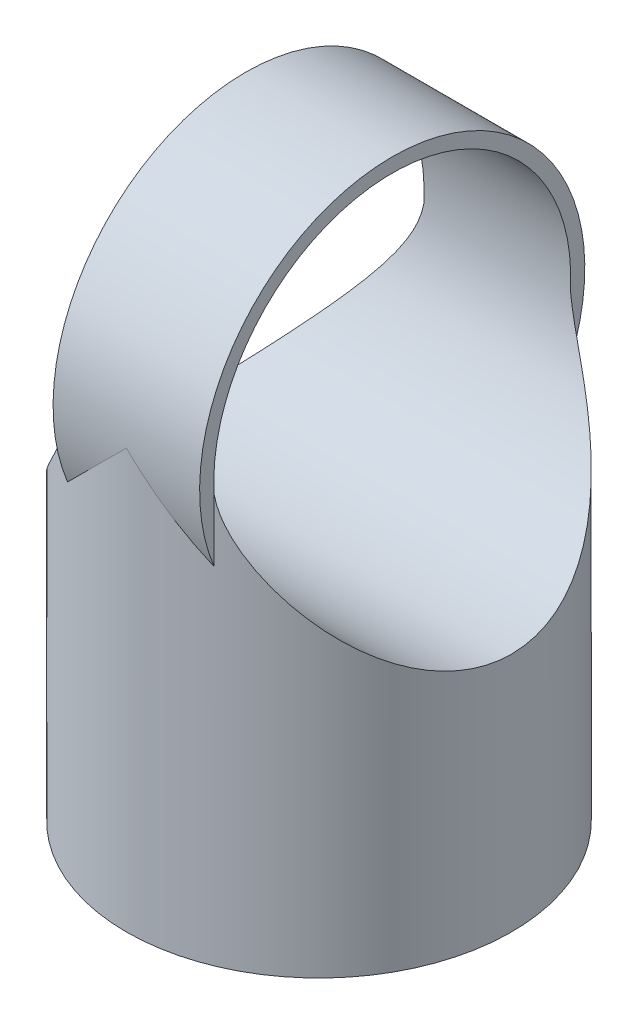
ISO-10303-21;
HEADER;
FILE_DESCRIPTION(('STEP AP214'),'2;1');
FILE_NAME('part.step','',(''),(''),'','','');
FILE_SCHEMA(('AUTOMOTIVE_DESIGN { 1 0 10303 214 1 1 1 1 }'));
ENDSEC;
DATA;
#1=APPLICATION_CONTEXT('core data for automotive mechanical design processes');
#2=APPLICATION_PROTOCOL_DEFINITION('international standard','automotive_design',2000,#1);
#3=PRODUCT_CONTEXT('',#1,'mechanical');
#4=PRODUCT('Part','Part','',(#3));
#5=PRODUCT_RELATED_PRODUCT_CATEGORY('part','',(#4));
#6=PRODUCT_DEFINITION_FORMATION('','',#4);
#7=PRODUCT_DEFINITION_CONTEXT('part definition',#1,'design');
#8=PRODUCT_DEFINITION('design','',#6,#7);
#9=PRODUCT_DEFINITION_SHAPE('','',#8);
#10=(LENGTH_UNIT() NAMED_UNIT(*) SI_UNIT(.MILLI.,.METRE.));
#11=(NAMED_UNIT(*) PLANE_ANGLE_UNIT() SI_UNIT($,.RADIAN.));
#12=(NAMED_UNIT(*) SI_UNIT($,.STERADIAN.) SOLID_ANGLE_UNIT());
#13=UNCERTAINTY_MEASURE_WITH_UNIT(LENGTH_MEASURE(1.E-05),#10,'distance_accuracy_value','');
#14=(GEOMETRIC_REPRESENTATION_CONTEXT(3) GLOBAL_UNCERTAINTY_ASSIGNED_CONTEXT((#13)) GLOBAL_UNIT_ASSIGNED_CONTEXT((#10,
#11,#12)) REPRESENTATION_CONTEXT('',''));
#15=CARTESIAN_POINT('',(0.,0.,0.));
#16=DIRECTION('',(0.,0.,1.));
#17=DIRECTION('',(1.,0.,0.));
#18=AXIS2_PLACEMENT_3D('',#15,#16,#17);
#19=CARTESIAN_POINT('',(44.45,0.,0.));
#20=DIRECTION('',(1.,0.,0.));
#21=DIRECTION('',(0.,0.,-1.));
#22=AXIS2_PLACEMENT_3D('',#19,#20,#21);
#23=PLANE('',#22);
#24=CARTESIAN_POINT('',(44.45,0.,0.));
#25=DIRECTION('',(1.,0.,0.));
#26=DIRECTION('',(0.,0.,-1.));
#27=AXIS2_PLACEMENT_3D('',#24,#25,#26);
#28=CIRCLE('',#27,108.247485137162);
#29=CARTESIAN_POINT('',(44.45,-6.46025839421604,-108.054537618741));
#30=VERTEX_POINT('',#29);
#31=CARTESIAN_POINT('',(44.45,-6.46025839421506,108.054537618741));
#32=VERTEX_POINT('',#31);
#33=EDGE_CURVE('E62',#30,#32,#28,.T.);
#34=ORIENTED_EDGE('',*,*,#33,.F.);
#35=DIRECTION('',(0.,1.,0.));
#36=VECTOR('',#35,1.);
#37=CARTESIAN_POINT('',(44.45,-116.84,-108.054537618741));
#38=LINE('',#37,#36);
#39=CARTESIAN_POINT('',(44.45,-44.45,-108.054537618741));
#40=VERTEX_POINT('',#39);
#41=EDGE_CURVE('E103',#40,#30,#38,.T.);
#42=ORIENTED_EDGE('',*,*,#41,.F.);
#43=CARTESIAN_POINT('',(44.45,0.,0.));
#44=DIRECTION('',(1.,0.,0.));
#45=DIRECTION('',(0.,0.,-1.));
#46=AXIS2_PLACEMENT_3D('',#43,#44,#45);
#47=CIRCLE('',#46,116.84);
#48=CARTESIAN_POINT('',(44.45,-44.45,108.054537618741));
#49=VERTEX_POINT('',#48);
#50=EDGE_CURVE('E111',#40,#49,#47,.T.);
#51=ORIENTED_EDGE('',*,*,#50,.T.);
#52=DIRECTION('',(0.,1.,0.));
#53=VECTOR('',#52,1.);
#54=CARTESIAN_POINT('',(44.45,-116.84,108.054537618741));
#55=LINE('',#54,#53);
#56=EDGE_CURVE('E102',#32,#49,#55,.F.);
#57=ORIENTED_EDGE('',*,*,#56,.F.);
#58=EDGE_LOOP('',(#34,#42,#51,#57));
#59=FACE_BOUND('',#58,.T.);
#60=ADVANCED_FACE('F36',(#59),#23,.T.);
#61=CARTESIAN_POINT('',(-44.45,0.,0.));
#62=DIRECTION('',(1.,0.,0.));
#63=DIRECTION('',(0.,0.,-1.));
#64=AXIS2_PLACEMENT_3D('',#61,#62,#63);
#65=PLANE('',#64);
#66=DIRECTION('',(0.,1.,0.));
#67=VECTOR('',#66,1.);
#68=CARTESIAN_POINT('',(-44.45,-116.84,-108.054537618741));
#69=LINE('',#68,#67);
#70=CARTESIAN_POINT('',(-44.45,-44.45,-108.054537618741));
#71=VERTEX_POINT('',#70);
#72=CARTESIAN_POINT('',(-44.45,-6.4602583942161,-108.054537618741));
#73=VERTEX_POINT('',#72);
#74=EDGE_CURVE('E95',#71,#73,#69,.T.);
#75=ORIENTED_EDGE('',*,*,#74,.T.);
#76=CARTESIAN_POINT('',(-44.45,0.,0.));
#77=DIRECTION('',(1.,0.,0.));
#78=DIRECTION('',(0.,0.,-1.));
#79=AXIS2_PLACEMENT_3D('',#76,#77,#78);
#80=CIRCLE('',#79,108.247485137162);
#81=CARTESIAN_POINT('',(-44.45,-6.46025839421495,108.054537618741));
#82=VERTEX_POINT('',#81);
#83=EDGE_CURVE('E56',#73,#82,#80,.T.);
#84=ORIENTED_EDGE('',*,*,#83,.T.);
#85=DIRECTION('',(0.,1.,0.));
#86=VECTOR('',#85,1.);
#87=CARTESIAN_POINT('',(-44.45,-116.84,108.054537618741));
#88=LINE('',#87,#86);
#89=CARTESIAN_POINT('',(-44.45,-44.45,108.054537618741));
#90=VERTEX_POINT('',#89);
#91=EDGE_CURVE('E93',#82,#90,#88,.F.);
#92=ORIENTED_EDGE('',*,*,#91,.T.);
#93=CARTESIAN_POINT('',(-44.45,0.,0.));
#94=DIRECTION('',(1.,0.,0.));
#95=DIRECTION('',(0.,0.,-1.));
#96=AXIS2_PLACEMENT_3D('',#93,#94,#95);
#97=CIRCLE('',#96,116.84);
#98=EDGE_CURVE('E105',#71,#90,#97,.T.);
#99=ORIENTED_EDGE('',*,*,#98,.F.);
#100=EDGE_LOOP('',(#75,#84,#92,#99));
#101=FACE_BOUND('',#100,.T.);
#102=ADVANCED_FACE('F91',(#101),#65,.F.);
#103=CARTESIAN_POINT('',(44.45,0.,0.));
#104=DIRECTION('',(-1.,0.,0.));
#105=DIRECTION('',(0.,0.,1.));
#106=AXIS2_PLACEMENT_3D('',#103,#104,#105);
#107=CYLINDRICAL_SURFACE('',#106,116.84);
#108=ORIENTED_EDGE('',*,*,#98,.T.);
#109=CARTESIAN_POINT('',(0.,0.,0.));
#110=DIRECTION('',(-0.707106781186547,0.707106781186547,0.));
#111=DIRECTION('',(-0.707106781186547,-0.707106781186547,0.));
#112=AXIS2_PLACEMENT_3D('',#109,#110,#111);
#113=ELLIPSE('',#112,165.236712627672,116.84);
#114=CARTESIAN_POINT('',(0.,0.,116.84));
#115=VERTEX_POINT('',#114);
#116=EDGE_CURVE('E89',#90,#115,#113,.T.);
#117=ORIENTED_EDGE('',*,*,#116,.T.);
#118=CARTESIAN_POINT('',(0.,0.,0.));
#119=DIRECTION('',(-0.707106781186547,-0.707106781186547,0.));
#120=DIRECTION('',(-0.707106781186547,0.707106781186547,0.));
#121=AXIS2_PLACEMENT_3D('',#118,#119,#120);
#122=ELLIPSE('',#121,165.236712627672,116.84);
#123=EDGE_CURVE('E119',#115,#49,#122,.F.);
#124=ORIENTED_EDGE('',*,*,#123,.T.);
#125=ORIENTED_EDGE('',*,*,#50,.F.);
#126=CARTESIAN_POINT('',(0.,0.,-116.84));
#127=VERTEX_POINT('',#126);
#128=EDGE_CURVE('E114',#40,#127,#122,.F.);
#129=ORIENTED_EDGE('',*,*,#128,.T.);
#130=EDGE_CURVE('E118',#127,#71,#113,.T.);
#131=ORIENTED_EDGE('',*,*,#130,.T.);
#132=EDGE_LOOP('',(#108,#117,#124,#125,#129,#131));
#133=FACE_BOUND('',#132,.T.);
#134=ADVANCED_FACE('F38',(#133),#107,.T.);
#135=CARTESIAN_POINT('',(0.,-116.84,0.));
#136=DIRECTION('',(0.,1.,0.));
#137=DIRECTION('',(0.,0.,1.));
#138=AXIS2_PLACEMENT_3D('',#135,#136,#137);
#139=CYLINDRICAL_SURFACE('',#138,116.84);
#140=CARTESIAN_POINT('',(43.9780349888438,0.,108.247485137162));
#141=CARTESIAN_POINT('',(43.9779046267066,-0.751582837733273,108.247513614141));
#142=CARTESIAN_POINT('',(43.9972982517889,-1.50311461849039,108.239658475456));
#143=CARTESIAN_POINT('',(44.0741591544466,-3.00369861330107,108.208397162723));
#144=CARTESIAN_POINT('',(44.1316156472429,-3.75275146933466,108.18499539367));
#145=CARTESIAN_POINT('',(44.2833814834907,-5.24399641237475,108.122957962085));
#146=CARTESIAN_POINT('',(44.3775702138548,-5.98620289752441,108.084372153782));
#147=CARTESIAN_POINT('',(44.6010107895558,-7.46435958614417,107.992360797709));
#148=CARTESIAN_POINT('',(44.7302646599027,-8.20030942576102,107.938934392892));
#149=CARTESIAN_POINT('',(45.1615247370268,-10.3667195770977,107.759540912669));
#150=CARTESIAN_POINT('',(45.5103286263289,-11.7863813142077,107.613142376241));
#151=CARTESIAN_POINT('',(46.315284358333,-14.5892317206479,107.269149117349));
#152=CARTESIAN_POINT('',(46.7715342322159,-15.972385791991,107.071507625297));
#153=CARTESIAN_POINT('',(47.6568721541818,-18.3865721314472,106.679829254836));
#154=CARTESIAN_POINT('',(48.0682805671794,-19.4257473179975,106.495318764759));
#155=CARTESIAN_POINT('',(48.9348508886564,-21.4806979734941,106.099918453183));
#156=CARTESIAN_POINT('',(49.3900199870243,-22.4964695631225,105.889024295123));
#157=CARTESIAN_POINT('',(50.3369405286435,-24.5056198367273,105.442174883744));
#158=CARTESIAN_POINT('',(50.828707218277,-25.4989889608444,105.206209168027));
#159=CARTESIAN_POINT('',(51.8423774380951,-27.4640300106264,104.710418985912));
#160=CARTESIAN_POINT('',(52.3642796270969,-28.435702899219,104.450595581));
#161=CARTESIAN_POINT('',(53.4393828470847,-30.3702903296379,103.904695831994));
#162=CARTESIAN_POINT('',(53.9928854177055,-31.3329579515636,103.618340685335));
#163=CARTESIAN_POINT('',(55.1207249458479,-33.238782931198,103.022803411044));
#164=CARTESIAN_POINT('',(55.6950618937372,-34.1819402979266,102.713621293966));
#165=CARTESIAN_POINT('',(56.8605631169237,-36.0498080469391,102.073032759961));
#166=CARTESIAN_POINT('',(57.4517237880717,-36.9745223091624,101.741631082811));
#167=CARTESIAN_POINT('',(58.647744416983,-38.8068492243988,101.056928780316));
#168=CARTESIAN_POINT('',(59.2526050701471,-39.7144610049997,100.703627041752));
#169=CARTESIAN_POINT('',(61.0090141681133,-42.3033845068166,99.6557319912776));
#170=CARTESIAN_POINT('',(62.1743166551933,-43.96440431703,98.9338179139397));
#171=CARTESIAN_POINT('',(64.5283520423318,-47.2348062523951,97.4147908038586));
#172=CARTESIAN_POINT('',(65.7170882693959,-48.8441809587466,96.6176670314991));
#173=CARTESIAN_POINT('',(68.1072457535171,-52.0155341442164,94.9479614732028));
#174=CARTESIAN_POINT('',(69.3086747681688,-53.5774810711039,94.0753308790165));
#175=CARTESIAN_POINT('',(71.7140516496735,-56.6547243883287,92.254841217935));
#176=CARTESIAN_POINT('',(72.9179993832613,-58.1700231833196,91.3069860378168));
#177=CARTESIAN_POINT('',(75.3160822998192,-61.1491820639401,89.3390752537673));
#178=CARTESIAN_POINT('',(76.5102373504265,-62.6132137916201,88.3193038410382));
#179=CARTESIAN_POINT('',(78.8863843911978,-65.4954892802394,86.2035667270866));
#180=CARTESIAN_POINT('',(80.0683760444228,-66.913731775082,85.1075989216309));
#181=CARTESIAN_POINT('',(82.4131895003346,-69.702478451305,82.8390689792639));
#182=CARTESIAN_POINT('',(83.5760207374263,-71.0730065207153,81.666546040078));
#183=CARTESIAN_POINT('',(85.8768129754217,-73.7648083187223,79.2436138212029));
#184=CARTESIAN_POINT('',(87.0147757438092,-75.0860855524789,77.9932101012365));
#185=CARTESIAN_POINT('',(89.8052346129973,-78.3060444210832,74.7867430254291));
#186=CARTESIAN_POINT('',(91.4393264001327,-80.1736402996891,72.7827983186428));
#187=CARTESIAN_POINT('',(93.8238041475361,-82.8795462504214,69.6448603039255));
#188=CARTESIAN_POINT('',(94.607583097579,-83.7656706635009,68.5767822285882));
#189=CARTESIAN_POINT('',(96.1504562847609,-85.5044074456729,66.3962254840292));
#190=CARTESIAN_POINT('',(96.9095500732356,-86.357019205716,65.283746008609));
#191=CARTESIAN_POINT('',(98.3995666727771,-88.0258378602419,63.0154796986832));
#192=CARTESIAN_POINT('',(99.1305139539091,-88.8420764786262,61.8597322875264));
#193=CARTESIAN_POINT('',(100.562102993741,-90.4366757969308,59.5041879548916));
#194=CARTESIAN_POINT('',(101.262745716007,-91.215037701282,58.3043924362184));
#195=CARTESIAN_POINT('',(102.63069566724,-92.7313272891947,55.8613071452962));
#196=CARTESIAN_POINT('',(103.298007752801,-93.4692608650798,54.6180237548015));
#197=CARTESIAN_POINT('',(104.59633405218,-94.9021464891337,52.0885132778631));
#198=CARTESIAN_POINT('',(105.227350480415,-95.597101159663,50.8022888188596));
#199=CARTESIAN_POINT('',(106.324865304324,-96.8037123482759,48.4554036616205));
#200=CARTESIAN_POINT('',(106.798607636215,-97.3237785778698,47.4024398748618));
#201=CARTESIAN_POINT('',(107.71954806681,-98.3334954507417,45.2706591009581));
#202=CARTESIAN_POINT('',(108.166747227311,-98.823147310713,44.1918431503961));
#203=CARTESIAN_POINT('',(109.032982168356,-99.770538902197,42.0092006393984));
#204=CARTESIAN_POINT('',(109.452018622793,-100.228279397313,40.9053746782625));
#205=CARTESIAN_POINT('',(110.260284497627,-101.110305818139,38.6738076343134));
#206=CARTESIAN_POINT('',(110.6495165407,-101.534594687564,37.5460686669325));
#207=CARTESIAN_POINT('',(111.396487359624,-102.348110812892,35.2681782361794));
#208=CARTESIAN_POINT('',(111.754236332631,-102.737349422298,34.1180341781766));
#209=CARTESIAN_POINT('',(112.436780396903,-103.479385437661,31.7965349078875));
#210=CARTESIAN_POINT('',(112.761578973463,-103.832186697812,30.6251819544282));
#211=CARTESIAN_POINT('',(113.376803058753,-104.499994163014,28.2626314868271));
#212=CARTESIAN_POINT('',(113.667223732021,-104.814995051295,27.0714312078542));
#213=CARTESIAN_POINT('',(114.212189214631,-105.405737986603,24.6713514300562));
#214=CARTESIAN_POINT('',(114.46673797718,-105.681484359644,23.462473895557));
#215=CARTESIAN_POINT('',(114.940375170026,-106.194312552434,21.0203195748206));
#216=CARTESIAN_POINT('',(115.159197852568,-106.431104702944,19.7869302820636));
#217=CARTESIAN_POINT('',(115.55798079903,-106.862463599135,17.3065445490516));
#218=CARTESIAN_POINT('',(115.737941017003,-107.057030294895,16.0595480927112));
#219=CARTESIAN_POINT('',(116.057988692268,-107.402949150839,13.5544582257012));
#220=CARTESIAN_POINT('',(116.198075442488,-107.554300544691,12.296364618655));
#221=CARTESIAN_POINT('',(116.437559130131,-107.812986263415,9.77180084644413));
#222=CARTESIAN_POINT('',(116.536956168621,-107.920320697618,8.50533070209358));
#223=CARTESIAN_POINT('',(116.694442155491,-108.09036171948,5.96730679114515));
#224=CARTESIAN_POINT('',(116.752546437612,-108.153084873194,4.69575508812093));
#225=CARTESIAN_POINT('',(116.827157394983,-108.23362404536,2.149999616565));
#226=CARTESIAN_POINT('',(116.843663800993,-108.25143977315,0.875795830921248));
#227=CARTESIAN_POINT('',(116.834979084326,-108.242065660165,-1.6721997994381));
#228=CARTESIAN_POINT('',(116.809791253439,-108.214879372329,-2.94599166873355));
#229=CARTESIAN_POINT('',(116.717875947021,-108.11565731209,-5.49030206227064));
#230=CARTESIAN_POINT('',(116.651149519615,-108.043622671325,-6.76082066829296));
#231=CARTESIAN_POINT('',(116.48628222772,-107.865598656234,-9.1545891872422));
#232=CARTESIAN_POINT('',(116.392464852741,-107.764281301239,-10.2784899193735));
#233=CARTESIAN_POINT('',(116.172774568108,-107.526964087321,-12.5195760758633));
#234=CARTESIAN_POINT('',(116.046898977407,-107.390961327636,-13.6367609305664));
#235=CARTESIAN_POINT('',(115.763698153874,-107.084871102131,-15.8622129104423));
#236=CARTESIAN_POINT('',(115.606378855672,-106.914790068167,-16.9704816774232));
#237=CARTESIAN_POINT('',(115.260959948901,-106.54119574808,-19.1766381706056));
#238=CARTESIAN_POINT('',(115.072857471863,-106.337679346341,-20.274524919285));
#239=CARTESIAN_POINT('',(114.666703184096,-105.898028027496,-22.4580934138982));
#240=CARTESIAN_POINT('',(114.448652836023,-105.6618947034,-23.5437757530961));
#241=CARTESIAN_POINT('',(113.983483532167,-105.157864047566,-25.7015435603753));
#242=CARTESIAN_POINT('',(113.736362007936,-104.889963909203,-26.7736278177774));
#243=CARTESIAN_POINT('',(113.214056566178,-104.323377551241,-28.902667937758));
#244=CARTESIAN_POINT('',(112.938873942372,-104.024692750921,-29.9596244952197));
#245=CARTESIAN_POINT('',(112.361486632851,-103.397539011733,-32.057227446562));
#246=CARTESIAN_POINT('',(112.059279539033,-103.069067418577,-33.0978723772111));
#247=CARTESIAN_POINT('',(111.089445283186,-102.014097459863,-36.2731323711952));
#248=CARTESIAN_POINT('',(110.378742363772,-101.239866076816,-38.3791085936004));
#249=CARTESIAN_POINT('',(108.855786604249,-99.577235898867,-42.507007076233));
#250=CARTESIAN_POINT('',(108.043534192165,-98.6888375851727,-44.528929690694));
#251=CARTESIAN_POINT('',(106.327504868035,-96.8071269303756,-48.4839727086107));
#252=CARTESIAN_POINT('',(105.423695048619,-95.8137768621841,-50.4170608178887));
#253=CARTESIAN_POINT('',(103.534892124231,-93.7315235474657,-54.190067270417));
#254=CARTESIAN_POINT('',(102.54988845368,-92.6426078639994,-56.0299734376559));
#255=CARTESIAN_POINT('',(100.751114034027,-90.6468926956474,-59.1884460246451));
#256=CARTESIAN_POINT('',(99.9522150965561,-89.7582388418739,-60.5270730686702));
#257=CARTESIAN_POINT('',(98.3170775343918,-87.9337479061771,-63.1484297587119));
#258=CARTESIAN_POINT('',(97.4808353765992,-86.997906358667,-64.4311540929045));
#259=CARTESIAN_POINT('',(95.774798434405,-85.0819290487591,-66.9408459707675));
#260=CARTESIAN_POINT('',(94.9049912472773,-84.1017768896029,-68.1677925319017));
#261=CARTESIAN_POINT('',(93.1359841816386,-82.1003235614311,-70.5655270411014));
#262=CARTESIAN_POINT('',(92.236785023871,-81.0790234012946,-71.7363163645075));
#263=CARTESIAN_POINT('',(90.4108669473058,-78.9956295762123,-74.0243698236154));
#264=CARTESIAN_POINT('',(89.4840965500518,-77.9334583546295,-75.1415221388377));
#265=CARTESIAN_POINT('',(87.6083918741938,-75.7723619983154,-77.3202532139021));
#266=CARTESIAN_POINT('',(86.6594574530496,-74.6734366271931,-78.3818316161978));
#267=CARTESIAN_POINT('',(84.7432034161324,-72.4408111748315,-80.4497466293361));
#268=CARTESIAN_POINT('',(83.7758874347573,-71.3071179412263,-81.4560940105525));
#269=CARTESIAN_POINT('',(81.8262806206233,-69.0061309653569,-83.4143531149408));
#270=CARTESIAN_POINT('',(80.8439897844398,-67.8388372154086,-84.3662648256635));
#271=CARTESIAN_POINT('',(78.8444102087771,-65.4432512240924,-86.238419625088));
#272=CARTESIAN_POINT('',(77.8268470150507,-64.2141675054445,-87.1573563048944));
#273=CARTESIAN_POINT('',(75.783983471176,-61.7223919074055,-88.9393647245971));
#274=CARTESIAN_POINT('',(74.7586830552945,-60.4596997422563,-89.8024359892798));
#275=CARTESIAN_POINT('',(72.7044606264807,-57.9003800938689,-91.4734963780629));
#276=CARTESIAN_POINT('',(71.6755375177665,-56.6037414109342,-92.2814669980847));
#277=CARTESIAN_POINT('',(69.6193838912304,-53.9764763951212,-93.8423831234375));
#278=CARTESIAN_POINT('',(68.5921533518446,-52.6458504988707,-94.5953293351781));
#279=CARTESIAN_POINT('',(66.5448775713189,-49.9492121550936,-96.0465476836334));
#280=CARTESIAN_POINT('',(65.5248337556162,-48.5831929256345,-96.7448092372221));
#281=CARTESIAN_POINT('',(63.4988561929874,-45.8140650962957,-98.0864763204908));
#282=CARTESIAN_POINT('',(62.4929232429242,-44.4109544146062,-98.729878762526));
#283=CARTESIAN_POINT('',(60.5041957179743,-41.5659089065467,-99.960964328572));
#284=CARTESIAN_POINT('',(59.5213866085136,-40.1239997590951,-100.548683196293));
#285=CARTESIAN_POINT('',(57.5888757311098,-37.1970407061543,-101.667856324514));
#286=CARTESIAN_POINT('',(56.6391683260193,-35.7119982259296,-102.199320196828));
#287=CARTESIAN_POINT('',(54.8436683555467,-32.7873307629153,-103.173325945459));
#288=CARTESIAN_POINT('',(53.9950825035301,-31.3505858934091,-103.619335956964));
#289=CARTESIAN_POINT('',(52.3535209915251,-28.4303075330406,-104.458334482427));
#290=CARTESIAN_POINT('',(51.5605447474408,-26.9467745338551,-104.851323553331));
#291=CARTESIAN_POINT('',(50.0548159594019,-23.9394846587681,-105.578381830566));
#292=CARTESIAN_POINT('',(49.3415148019129,-22.4161052096394,-105.912864269017));
#293=CARTESIAN_POINT('',(48.0123561412764,-19.3152492165561,-106.521987420465));
#294=CARTESIAN_POINT('',(47.3964851516134,-17.737780196655,-106.796636417737));
#295=CARTESIAN_POINT('',(46.403951594236,-14.8558726721438,-107.231013999835));
#296=CARTESIAN_POINT('',(46.0041167128789,-13.5612627996986,-107.40275558967));
#297=CARTESIAN_POINT('',(45.3011093623281,-10.941269062116,-107.701168340712));
#298=CARTESIAN_POINT('',(44.9978705601393,-9.61590698855272,-107.82787043772));
#299=CARTESIAN_POINT('',(44.6246173703917,-7.59847483565527,-107.982625202772));
#300=CARTESIAN_POINT('',(44.5132195899354,-6.91523320779325,-108.028559418232));
#301=CARTESIAN_POINT('',(44.3208699053419,-5.54370777227168,-108.107617432747));
#302=CARTESIAN_POINT('',(44.2399167379487,-4.85542417502992,-108.140741763331));
#303=CARTESIAN_POINT('',(44.10963306407,-3.47360365071844,-108.193951365651));
#304=CARTESIAN_POINT('',(44.06038299274,-2.78005784324762,-108.214003472969));
#305=CARTESIAN_POINT('',(43.9945324738212,-1.39102029868252,-108.240782248534));
#306=CARTESIAN_POINT('',(43.9779388972408,-0.695528182899696,-108.247506112488));
#307=CARTESIAN_POINT('',(43.9780349888437,0.,-108.247485137162));
#308=B_SPLINE_CURVE_WITH_KNOTS('',3,(#140,#141,#142,#143,#144,#145,#146,#147,#148,#149,#150,
#151,#152,#153,#154,#155,#156,#157,#158,#159,#160,#161,#162,#163,#164,#165,#166,#167,#168,#169,
#170,#171,#172,#173,#174,#175,#176,#177,#178,#179,#180,#181,#182,#183,#184,#185,#186,#187,#188,
#189,#190,#191,#192,#193,#194,#195,#196,#197,#198,#199,#200,#201,#202,#203,#204,#205,#206,#207,
#208,#209,#210,#211,#212,#213,#214,#215,#216,#217,#218,#219,#220,#221,#222,#223,#224,#225,#226,
#227,#228,#229,#230,#231,#232,#233,#234,#235,#236,#237,#238,#239,#240,#241,#242,#243,#244,#245,
#246,#247,#248,#249,#250,#251,#252,#253,#254,#255,#256,#257,#258,#259,#260,#261,#262,#263,#264,
#265,#266,#267,#268,#269,#270,#271,#272,#273,#274,#275,#276,#277,#278,#279,#280,#281,#282,#283,
#284,#285,#286,#287,#288,#289,#290,#291,#292,#293,#294,#295,#296,#297,#298,#299,#300,#301,#302,
#303,#304,#305,#306,#307),.UNSPECIFIED.,.F.,.F.,(4,2,2,2,2,2,2,2,2,2,2,2,2,2,2,2,2,2,2,2,2,2,2,
2,2,2,2,2,2,2,2,2,2,2,2,2,2,2,2,2,2,2,2,2,2,2,2,2,2,2,2,2,2,2,2,2,2,2,2,2,2,2,2,2,2,2,2,2,2,2,2,
2,2,2,2,2,2,2,2,2,2,2,2,4),(0.,2.25437349211173,4.50810850034065,6.75450467668367,
9.00103060991672,13.4019593508641,17.8069190588574,21.2037854699006,24.6012109435846,
28.0000597780189,31.3987574628329,34.8384403417701,38.2781216304459,41.7170715018104,
45.1561963246257,51.6146087627506,58.0739448337785,64.5374879205965,71.0006972599355,
77.4396605675351,83.878801763696,90.3146714638826,96.7500822481371,106.309675224821,
111.090274747451,115.870961111199,120.647392811417,125.423672527841,130.199254251813,
134.974544305318,138.772740013709,142.570783681477,146.368736435058,150.166354598021,
153.962738175618,157.758719775116,161.555234669805,165.351330847887,169.174490775153,
172.997655222339,176.820887461006,180.644110203241,184.465912478865,188.287739490841,
192.109264781286,195.930693648686,199.326758138786,202.723106737037,206.118814918831,
209.514839703266,212.910698684669,216.306857917057,219.702860644668,223.09916628647,
230.152613589503,237.206031163637,244.261992917904,251.318874302823,256.700239687822,
262.082115295282,267.4659989866,272.84975075445,278.244278067403,283.638840082919,
289.032346361793,294.425853874132,299.948670326991,305.471533752984,310.996242843648,
316.520880994993,322.04658570132,327.572601206831,333.095045141195,338.616543974207,
343.796208078559,348.975817770119,354.117220718536,359.257911357832,363.351583274063,
367.442437955421,369.523121775723,371.603719251476,373.689574900198,375.77586937128),.UNSPECIFIED.);
#309=EDGE_CURVE('E11',#32,#30,#308,.T.);
#310=ORIENTED_EDGE('',*,*,#309,.F.);
#311=ORIENTED_EDGE('',*,*,#56,.T.);
#312=ORIENTED_EDGE('',*,*,#123,.F.);
#313=ORIENTED_EDGE('',*,*,#116,.F.);
#314=ORIENTED_EDGE('',*,*,#91,.F.);
#315=CARTESIAN_POINT('',(-43.9780349888438,0.,-108.247485137162));
#316=CARTESIAN_POINT('',(-43.9779046267065,-0.751582837733282,-108.247513614141));
#317=CARTESIAN_POINT('',(-43.9972982517888,-1.5031146184904,-108.239658475456));
#318=CARTESIAN_POINT('',(-44.0741591544465,-3.00369861330107,-108.208397162723));
#319=CARTESIAN_POINT('',(-44.1316156472427,-3.75275146933467,-108.18499539367));
#320=CARTESIAN_POINT('',(-44.2833814834905,-5.24399641237475,-108.122957962085));
#321=CARTESIAN_POINT('',(-44.3775702138547,-5.98620289752441,-108.084372153782));
#322=CARTESIAN_POINT('',(-44.6010107895557,-7.46435958614417,-107.992360797709));
#323=CARTESIAN_POINT('',(-44.7302646599026,-8.20030942576101,-107.938934392892));
#324=CARTESIAN_POINT('',(-45.1615247370267,-10.3667195770977,-107.759540912669));
#325=CARTESIAN_POINT('',(-45.5103286263288,-11.7863813142077,-107.613142376241));
#326=CARTESIAN_POINT('',(-46.3152843583329,-14.5892317206479,-107.269149117349));
#327=CARTESIAN_POINT('',(-46.7715342322158,-15.9723857919909,-107.071507625297));
#328=CARTESIAN_POINT('',(-47.6568721541817,-18.3865721314471,-106.679829254836));
#329=CARTESIAN_POINT('',(-48.0682805671792,-19.4257473179975,-106.495318764759));
#330=CARTESIAN_POINT('',(-48.9348508886563,-21.480697973494,-106.099918453183));
#331=CARTESIAN_POINT('',(-49.3900199870242,-22.4964695631225,-105.889024295123));
#332=CARTESIAN_POINT('',(-50.3369405286434,-24.5056198367272,-105.442174883744));
#333=CARTESIAN_POINT('',(-50.8287072182769,-25.4989889608443,-105.206209168027));
#334=CARTESIAN_POINT('',(-51.8423774380949,-27.4640300106263,-104.710418985912));
#335=CARTESIAN_POINT('',(-52.3642796270968,-28.435702899219,-104.450595581));
#336=CARTESIAN_POINT('',(-53.4393828470846,-30.3702903296379,-103.904695831994));
#337=CARTESIAN_POINT('',(-53.9928854177053,-31.3329579515636,-103.618340685335));
#338=CARTESIAN_POINT('',(-55.1207249458478,-33.238782931198,-103.022803411044));
#339=CARTESIAN_POINT('',(-55.6950618937371,-34.1819402979266,-102.713621293966));
#340=CARTESIAN_POINT('',(-56.8605631169236,-36.0498080469391,-102.073032759961));
#341=CARTESIAN_POINT('',(-57.4517237880716,-36.9745223091624,-101.741631082811));
#342=CARTESIAN_POINT('',(-58.6477444169829,-38.8068492243987,-101.056928780316));
#343=CARTESIAN_POINT('',(-59.252605070147,-39.7144610049996,-100.703627041752));
#344=CARTESIAN_POINT('',(-61.0090141681132,-42.3033845068166,-99.6557319912776));
#345=CARTESIAN_POINT('',(-62.1743166551932,-43.96440431703,-98.9338179139397));
#346=CARTESIAN_POINT('',(-64.5283520423317,-47.234806252395,-97.4147908038586));
#347=CARTESIAN_POINT('',(-65.7170882693958,-48.8441809587466,-96.6176670314991));
#348=CARTESIAN_POINT('',(-68.107245753517,-52.0155341442164,-94.9479614732028));
#349=CARTESIAN_POINT('',(-69.3086747681687,-53.5774810711039,-94.0753308790165));
#350=CARTESIAN_POINT('',(-71.7140516496734,-56.6547243883287,-92.254841217935));
#351=CARTESIAN_POINT('',(-72.9179993832613,-58.1700231833196,-91.3069860378169));
#352=CARTESIAN_POINT('',(-75.3160822998191,-61.1491820639401,-89.3390752537673));
#353=CARTESIAN_POINT('',(-76.5102373504264,-62.6132137916201,-88.3193038410382));
#354=CARTESIAN_POINT('',(-78.8863843911978,-65.4954892802394,-86.2035667270866));
#355=CARTESIAN_POINT('',(-80.0683760444228,-66.913731775082,-85.1075989216308));
#356=CARTESIAN_POINT('',(-82.4131895003346,-69.702478451305,-82.8390689792639));
#357=CARTESIAN_POINT('',(-83.5760207374263,-71.0730065207153,-81.666546040078));
#358=CARTESIAN_POINT('',(-85.8768129754216,-73.7648083187223,-79.2436138212029));
#359=CARTESIAN_POINT('',(-87.0147757438091,-75.0860855524789,-77.9932101012365));
#360=CARTESIAN_POINT('',(-89.8052346129972,-78.3060444210832,-74.7867430254291));
#361=CARTESIAN_POINT('',(-91.4393264001327,-80.173640299689,-72.7827983186428));
#362=CARTESIAN_POINT('',(-93.823804147536,-82.8795462504214,-69.6448603039255));
#363=CARTESIAN_POINT('',(-94.6075830975789,-83.7656706635009,-68.5767822285882));
#364=CARTESIAN_POINT('',(-96.1504562847609,-85.5044074456729,-66.3962254840292));
#365=CARTESIAN_POINT('',(-96.9095500732355,-86.357019205716,-65.283746008609));
#366=CARTESIAN_POINT('',(-98.3995666727771,-88.0258378602419,-63.0154796986832));
#367=CARTESIAN_POINT('',(-99.1305139539091,-88.8420764786262,-61.8597322875264));
#368=CARTESIAN_POINT('',(-100.562102993741,-90.4366757969308,-59.5041879548916));
#369=CARTESIAN_POINT('',(-101.262745716007,-91.215037701282,-58.3043924362183));
#370=CARTESIAN_POINT('',(-102.63069566724,-92.7313272891947,-55.8613071452962));
#371=CARTESIAN_POINT('',(-103.298007752801,-93.4692608650798,-54.6180237548015));
#372=CARTESIAN_POINT('',(-104.59633405218,-94.9021464891337,-52.0885132778631));
#373=CARTESIAN_POINT('',(-105.227350480415,-95.597101159663,-50.8022888188596));
#374=CARTESIAN_POINT('',(-106.324865304324,-96.8037123482759,-48.4554036616205));
#375=CARTESIAN_POINT('',(-106.798607636215,-97.3237785778698,-47.4024398748618));
#376=CARTESIAN_POINT('',(-107.71954806681,-98.3334954507417,-45.2706591009581));
#377=CARTESIAN_POINT('',(-108.166747227311,-98.8231473107129,-44.1918431503961));
#378=CARTESIAN_POINT('',(-109.032982168356,-99.770538902197,-42.0092006393984));
#379=CARTESIAN_POINT('',(-109.452018622793,-100.228279397313,-40.9053746782625));
#380=CARTESIAN_POINT('',(-110.260284497627,-101.110305818139,-38.6738076343134));
#381=CARTESIAN_POINT('',(-110.6495165407,-101.534594687564,-37.5460686669325));
#382=CARTESIAN_POINT('',(-111.396487359624,-102.348110812892,-35.2681782361794));
#383=CARTESIAN_POINT('',(-111.754236332631,-102.737349422298,-34.1180341781766));
#384=CARTESIAN_POINT('',(-112.436780396903,-103.479385437661,-31.7965349078875));
#385=CARTESIAN_POINT('',(-112.761578973463,-103.832186697812,-30.6251819544282));
#386=CARTESIAN_POINT('',(-113.376803058753,-104.499994163014,-28.2626314868271));
#387=CARTESIAN_POINT('',(-113.667223732021,-104.814995051295,-27.0714312078541));
#388=CARTESIAN_POINT('',(-114.212189214631,-105.405737986603,-24.6713514300561));
#389=CARTESIAN_POINT('',(-114.46673797718,-105.681484359644,-23.462473895557));
#390=CARTESIAN_POINT('',(-114.940375170026,-106.194312552434,-21.0203195748206));
#391=CARTESIAN_POINT('',(-115.159197852568,-106.431104702944,-19.7869302820636));
#392=CARTESIAN_POINT('',(-115.55798079903,-106.862463599135,-17.3065445490516));
#393=CARTESIAN_POINT('',(-115.737941017003,-107.057030294895,-16.0595480927112));
#394=CARTESIAN_POINT('',(-116.057988692268,-107.402949150839,-13.5544582257012));
#395=CARTESIAN_POINT('',(-116.198075442488,-107.554300544691,-12.296364618655));
#396=CARTESIAN_POINT('',(-116.437559130131,-107.812986263415,-9.77180084644415));
#397=CARTESIAN_POINT('',(-116.536956168621,-107.920320697618,-8.5053307020936));
#398=CARTESIAN_POINT('',(-116.694442155491,-108.09036171948,-5.96730679114517));
#399=CARTESIAN_POINT('',(-116.752546437612,-108.153084873194,-4.69575508812095));
#400=CARTESIAN_POINT('',(-116.827157394983,-108.23362404536,-2.14999961656502));
#401=CARTESIAN_POINT('',(-116.843663800993,-108.25143977315,-0.875795830921268));
#402=CARTESIAN_POINT('',(-116.834979084326,-108.242065660165,1.67219979943809));
#403=CARTESIAN_POINT('',(-116.809791253439,-108.214879372329,2.94599166873354));
#404=CARTESIAN_POINT('',(-116.717875947021,-108.11565731209,5.49030206227064));
#405=CARTESIAN_POINT('',(-116.651149519615,-108.043622671325,6.76082066829296));
#406=CARTESIAN_POINT('',(-116.48628222772,-107.865598656234,9.15458918724221));
#407=CARTESIAN_POINT('',(-116.392464852741,-107.764281301239,10.2784899193735));
#408=CARTESIAN_POINT('',(-116.172774568108,-107.526964087321,12.5195760758633));
#409=CARTESIAN_POINT('',(-116.046898977407,-107.390961327636,13.6367609305664));
#410=CARTESIAN_POINT('',(-115.763698153874,-107.084871102131,15.8622129104423));
#411=CARTESIAN_POINT('',(-115.606378855672,-106.914790068167,16.9704816774232));
#412=CARTESIAN_POINT('',(-115.260959948901,-106.54119574808,19.1766381706056));
#413=CARTESIAN_POINT('',(-115.072857471863,-106.337679346341,20.274524919285));
#414=CARTESIAN_POINT('',(-114.666703184096,-105.898028027496,22.4580934138983));
#415=CARTESIAN_POINT('',(-114.448652836023,-105.6618947034,23.5437757530961));
#416=CARTESIAN_POINT('',(-113.983483532167,-105.157864047566,25.7015435603753));
#417=CARTESIAN_POINT('',(-113.736362007936,-104.889963909203,26.7736278177774));
#418=CARTESIAN_POINT('',(-113.214056566178,-104.323377551241,28.902667937758));
#419=CARTESIAN_POINT('',(-112.938873942372,-104.024692750921,29.9596244952197));
#420=CARTESIAN_POINT('',(-112.361486632851,-103.397539011733,32.057227446562));
#421=CARTESIAN_POINT('',(-112.059279539033,-103.069067418577,33.0978723772111));
#422=CARTESIAN_POINT('',(-111.089445283186,-102.014097459863,36.2731323711953));
#423=CARTESIAN_POINT('',(-110.378742363772,-101.239866076816,38.3791085936004));
#424=CARTESIAN_POINT('',(-108.855786604249,-99.577235898867,42.507007076233));
#425=CARTESIAN_POINT('',(-108.043534192165,-98.6888375851727,44.528929690694));
#426=CARTESIAN_POINT('',(-106.327504868035,-96.8071269303756,48.4839727086107));
#427=CARTESIAN_POINT('',(-105.423695048619,-95.813776862184,50.4170608178887));
#428=CARTESIAN_POINT('',(-103.534892124231,-93.7315235474657,54.190067270417));
#429=CARTESIAN_POINT('',(-102.54988845368,-92.6426078639994,56.0299734376559));
#430=CARTESIAN_POINT('',(-100.751114034027,-90.6468926956474,59.1884460246451));
#431=CARTESIAN_POINT('',(-99.9522150965561,-89.7582388418739,60.5270730686703));
#432=CARTESIAN_POINT('',(-98.3170775343918,-87.933747906177,63.1484297587119));
#433=CARTESIAN_POINT('',(-97.4808353765992,-86.997906358667,64.4311540929045));
#434=CARTESIAN_POINT('',(-95.774798434405,-85.0819290487591,66.9408459707675));
#435=CARTESIAN_POINT('',(-94.9049912472773,-84.1017768896029,68.1677925319017));
#436=CARTESIAN_POINT('',(-93.1359841816387,-82.1003235614311,70.5655270411015));
#437=CARTESIAN_POINT('',(-92.236785023871,-81.0790234012946,71.7363163645075));
#438=CARTESIAN_POINT('',(-90.4108669473058,-78.9956295762123,74.0243698236154));
#439=CARTESIAN_POINT('',(-89.4840965500518,-77.9334583546295,75.1415221388377));
#440=CARTESIAN_POINT('',(-87.6083918741938,-75.7723619983154,77.3202532139022));
#441=CARTESIAN_POINT('',(-86.6594574530497,-74.6734366271931,78.3818316161978));
#442=CARTESIAN_POINT('',(-84.7432034161325,-72.4408111748315,80.4497466293362));
#443=CARTESIAN_POINT('',(-83.7758874347573,-71.3071179412263,81.4560940105525));
#444=CARTESIAN_POINT('',(-81.8262806206233,-69.0061309653569,83.4143531149408));
#445=CARTESIAN_POINT('',(-80.8439897844398,-67.8388372154086,84.3662648256635));
#446=CARTESIAN_POINT('',(-78.8444102087771,-65.4432512240924,86.2384196250881));
#447=CARTESIAN_POINT('',(-77.8268470150507,-64.2141675054445,87.1573563048944));
#448=CARTESIAN_POINT('',(-75.783983471176,-61.7223919074055,88.9393647245972));
#449=CARTESIAN_POINT('',(-74.7586830552946,-60.4596997422563,89.8024359892798));
#450=CARTESIAN_POINT('',(-72.7044606264807,-57.9003800938689,91.4734963780629));
#451=CARTESIAN_POINT('',(-71.6755375177665,-56.6037414109341,92.2814669980847));
#452=CARTESIAN_POINT('',(-69.6193838912305,-53.9764763951211,93.8423831234375));
#453=CARTESIAN_POINT('',(-68.5921533518447,-52.6458504988707,94.5953293351781));
#454=CARTESIAN_POINT('',(-66.5448775713189,-49.9492121550936,96.0465476836334));
#455=CARTESIAN_POINT('',(-65.5248337556163,-48.5831929256345,96.7448092372221));
#456=CARTESIAN_POINT('',(-63.4988561929875,-45.8140650962956,98.0864763204909));
#457=CARTESIAN_POINT('',(-62.4929232429242,-44.4109544146061,98.729878762526));
#458=CARTESIAN_POINT('',(-60.5041957179744,-41.5659089065466,99.960964328572));
#459=CARTESIAN_POINT('',(-59.5213866085136,-40.1239997590951,100.548683196293));
#460=CARTESIAN_POINT('',(-57.5888757311098,-37.1970407061542,101.667856324514));
#461=CARTESIAN_POINT('',(-56.6391683260193,-35.7119982259296,102.199320196828));
#462=CARTESIAN_POINT('',(-54.8436683555468,-32.7873307629152,103.173325945459));
#463=CARTESIAN_POINT('',(-53.9950825035301,-31.350585893409,103.619335956964));
#464=CARTESIAN_POINT('',(-52.3535209915251,-28.4303075330405,104.458334482427));
#465=CARTESIAN_POINT('',(-51.5605447474409,-26.9467745338551,104.851323553331));
#466=CARTESIAN_POINT('',(-50.0548159594021,-23.9394846587681,105.578381830566));
#467=CARTESIAN_POINT('',(-49.341514801913,-22.4161052096393,105.912864269017));
#468=CARTESIAN_POINT('',(-48.0123561412765,-19.3152492165561,106.521987420465));
#469=CARTESIAN_POINT('',(-47.3964851516135,-17.737780196655,106.796636417737));
#470=CARTESIAN_POINT('',(-46.4039515942361,-14.8558726721437,107.231013999835));
#471=CARTESIAN_POINT('',(-46.0041167128791,-13.5612627996986,107.40275558967));
#472=CARTESIAN_POINT('',(-45.3011093623282,-10.941269062116,107.701168340712));
#473=CARTESIAN_POINT('',(-44.9978705601394,-9.61590698855267,107.82787043772));
#474=CARTESIAN_POINT('',(-44.6246173703918,-7.59847483565521,107.982625202772));
#475=CARTESIAN_POINT('',(-44.5132195899356,-6.91523320779318,108.028559418232));
#476=CARTESIAN_POINT('',(-44.3208699053421,-5.5437077722716,108.107617432747));
#477=CARTESIAN_POINT('',(-44.2399167379488,-4.85542417502985,108.140741763331));
#478=CARTESIAN_POINT('',(-44.1096330640702,-3.47360365071836,108.193951365651));
#479=CARTESIAN_POINT('',(-44.0603829927401,-2.78005784324753,108.214003472969));
#480=CARTESIAN_POINT('',(-43.9945324738213,-1.39102029868244,108.240782248534));
#481=CARTESIAN_POINT('',(-43.9779388972409,-0.695528182899632,108.247506112488));
#482=CARTESIAN_POINT('',(-43.9780349888439,0.,108.247485137162));
#483=B_SPLINE_CURVE_WITH_KNOTS('',3,(#315,#316,#317,#318,#319,#320,#321,#322,#323,#324,#325,
#326,#327,#328,#329,#330,#331,#332,#333,#334,#335,#336,#337,#338,#339,#340,#341,#342,#343,#344,
#345,#346,#347,#348,#349,#350,#351,#352,#353,#354,#355,#356,#357,#358,#359,#360,#361,#362,#363,
#364,#365,#366,#367,#368,#369,#370,#371,#372,#373,#374,#375,#376,#377,#378,#379,#380,#381,#382,
#383,#384,#385,#386,#387,#388,#389,#390,#391,#392,#393,#394,#395,#396,#397,#398,#399,#400,#401,
#402,#403,#404,#405,#406,#407,#408,#409,#410,#411,#412,#413,#414,#415,#416,#417,#418,#419,#420,
#421,#422,#423,#424,#425,#426,#427,#428,#429,#430,#431,#432,#433,#434,#435,#436,#437,#438,#439,
#440,#441,#442,#443,#444,#445,#446,#447,#448,#449,#450,#451,#452,#453,#454,#455,#456,#457,#458,
#459,#460,#461,#462,#463,#464,#465,#466,#467,#468,#469,#470,#471,#472,#473,#474,#475,#476,#477,
#478,#479,#480,#481,#482),.UNSPECIFIED.,.F.,.F.,(4,2,2,2,2,2,2,2,2,2,2,2,2,2,2,2,2,2,2,2,2,2,2,
2,2,2,2,2,2,2,2,2,2,2,2,2,2,2,2,2,2,2,2,2,2,2,2,2,2,2,2,2,2,2,2,2,2,2,2,2,2,2,2,2,2,2,2,2,2,2,2,
2,2,2,2,2,2,2,2,2,2,2,2,4),(0.,2.25437349211172,4.50810850034064,6.75450467668366,
9.00103060991671,13.4019593508641,17.8069190588574,21.2037854699005,24.6012109435846,
28.0000597780188,31.3987574628328,34.83844034177,38.2781216304459,41.7170715018104,
45.1561963246257,51.6146087627506,58.0739448337785,64.5374879205964,71.0006972599355,
77.4396605675352,83.8788017636961,90.3146714638827,96.7500822481371,106.309675224821,
111.090274747452,115.870961111199,120.647392811417,125.423672527841,130.199254251813,
134.974544305318,138.772740013709,142.570783681477,146.368736435058,150.166354598021,
153.962738175618,157.758719775116,161.555234669805,165.351330847887,169.174490775153,
172.997655222339,176.820887461006,180.644110203241,184.465912478865,188.287739490841,
192.109264781286,195.930693648686,199.326758138787,202.723106737037,206.118814918831,
209.514839703266,212.910698684669,216.306857917058,219.702860644668,223.09916628647,
230.152613589503,237.206031163637,244.261992917905,251.318874302823,256.700239687822,
262.082115295282,267.4659989866,272.84975075445,278.244278067403,283.638840082919,
289.032346361793,294.425853874132,299.948670326991,305.471533752984,310.996242843648,
316.520880994992,322.04658570132,327.572601206831,333.095045141195,338.616543974207,
343.796208078559,348.975817770119,354.117220718536,359.257911357831,363.351583274062,
367.442437955421,369.523121775723,371.603719251476,373.689574900197,375.77586937128),.UNSPECIFIED.);
#484=EDGE_CURVE('E50',#73,#82,#483,.T.);
#485=ORIENTED_EDGE('',*,*,#484,.F.);
#486=ORIENTED_EDGE('',*,*,#74,.F.);
#487=ORIENTED_EDGE('',*,*,#130,.F.);
#488=ORIENTED_EDGE('',*,*,#128,.F.);
#489=ORIENTED_EDGE('',*,*,#41,.T.);
#490=EDGE_LOOP('',(#310,#311,#312,#313,#314,#485,#486,#487,#488,#489));
#491=FACE_BOUND('',#490,.T.);
#492=CARTESIAN_POINT('',(0.,-254.257018713888,0.));
#493=DIRECTION('',(0.,1.,0.));
#494=DIRECTION('',(0.,0.,1.));
#495=AXIS2_PLACEMENT_3D('',#492,#493,#494);
#496=CIRCLE('',#495,116.84);
#497=CARTESIAN_POINT('',(0.,-254.257018713888,116.84));
#498=VERTEX_POINT('',#497);
#499=EDGE_CURVE('E150',#498,#498,#496,.T.);
#500=ORIENTED_EDGE('',*,*,#499,.T.);
#501=EDGE_LOOP('',(#500));
#502=FACE_BOUND('',#501,.T.);
#503=ADVANCED_FACE('F98',(#491,#502),#139,.T.);
#504=CARTESIAN_POINT('',(0.,-254.257018713888,116.84));
#505=DIRECTION('',(0.,-1.,0.));
#506=DIRECTION('',(0.,0.,-1.));
#507=AXIS2_PLACEMENT_3D('',#504,#505,#506);
#508=PLANE('',#507);
#509=CARTESIAN_POINT('',(0.,-254.257018713888,0.));
#510=DIRECTION('',(0.,-1.,0.));
#511=DIRECTION('',(0.,0.,-1.));
#512=AXIS2_PLACEMENT_3D('',#509,#510,#511);
#513=CIRCLE('',#512,76.2);
#514=CARTESIAN_POINT('',(0.,-254.257018713888,-76.2));
#515=VERTEX_POINT('',#514);
#516=EDGE_CURVE('E201',#515,#515,#513,.T.);
#517=ORIENTED_EDGE('',*,*,#516,.F.);
#518=EDGE_LOOP('',(#517));
#519=FACE_BOUND('',#518,.T.);
#520=ORIENTED_EDGE('',*,*,#499,.F.);
#521=EDGE_LOOP('',(#520));
#522=FACE_BOUND('',#521,.T.);
#523=ADVANCED_FACE('F132',(#519,#522),#508,.T.);
#524=CARTESIAN_POINT('',(-154.94,0.,0.));
#525=DIRECTION('',(1.,0.,0.));
#526=DIRECTION('',(0.,0.,-1.));
#527=AXIS2_PLACEMENT_3D('',#524,#525,#526);
#528=CYLINDRICAL_SURFACE('',#527,108.247485137162);
#529=ORIENTED_EDGE('',*,*,#33,.T.);
#530=ORIENTED_EDGE('',*,*,#309,.T.);
#531=EDGE_LOOP('',(#529,#530));
#532=FACE_BOUND('',#531,.T.);
#533=ORIENTED_EDGE('',*,*,#484,.T.);
#534=ORIENTED_EDGE('',*,*,#83,.F.);
#535=EDGE_LOOP('',(#533,#534));
#536=FACE_BOUND('',#535,.T.);
#537=ADVANCED_FACE('F85',(#532,#536),#528,.F.);
#538=CARTESIAN_POINT('',(0.,-190.757018713888,0.));
#539=DIRECTION('',(0.,-1.,0.));
#540=DIRECTION('',(0.,0.,-1.));
#541=AXIS2_PLACEMENT_3D('',#538,#539,#540);
#542=CYLINDRICAL_SURFACE('',#541,76.2);
#543=CARTESIAN_POINT('',(0.,-190.757018713888,0.));
#544=DIRECTION('',(0.,-1.,0.));
#545=DIRECTION('',(0.,0.,-1.));
#546=AXIS2_PLACEMENT_3D('',#543,#544,#545);
#547=CIRCLE('',#546,76.2);
#548=CARTESIAN_POINT('',(0.,-190.757018713888,-76.2));
#549=VERTEX_POINT('',#548);
#550=EDGE_CURVE('E96',#549,#549,#547,.T.);
#551=ORIENTED_EDGE('',*,*,#550,.F.);
#552=EDGE_LOOP('',(#551));
#553=FACE_BOUND('',#552,.T.);
#554=ORIENTED_EDGE('',*,*,#516,.T.);
#555=EDGE_LOOP('',(#554));
#556=FACE_BOUND('',#555,.T.);
#557=ADVANCED_FACE('F131',(#553,#556),#542,.F.);
#558=CARTESIAN_POINT('',(0.,-190.757018713888,0.));
#559=DIRECTION('',(0.,-1.,0.));
#560=DIRECTION('',(0.,0.,-1.));
#561=AXIS2_PLACEMENT_3D('',#558,#559,#560);
#562=PLANE('',#561);
#563=ORIENTED_EDGE('',*,*,#550,.T.);
#564=EDGE_LOOP('',(#563));
#565=FACE_BOUND('',#564,.T.);
#566=ADVANCED_FACE('F187',(#565),#562,.T.);
#567=CLOSED_SHELL('',(#60,#102,#134,#503,#523,#537,#557,#566));
#568=MANIFOLD_SOLID_BREP('B2',#567);
#569=ADVANCED_BREP_SHAPE_REPRESENTATION('',(#18,#568),#14);
#570=SHAPE_DEFINITION_REPRESENTATION(#9,#569);
ENDSEC;
END-ISO-10303-21;
